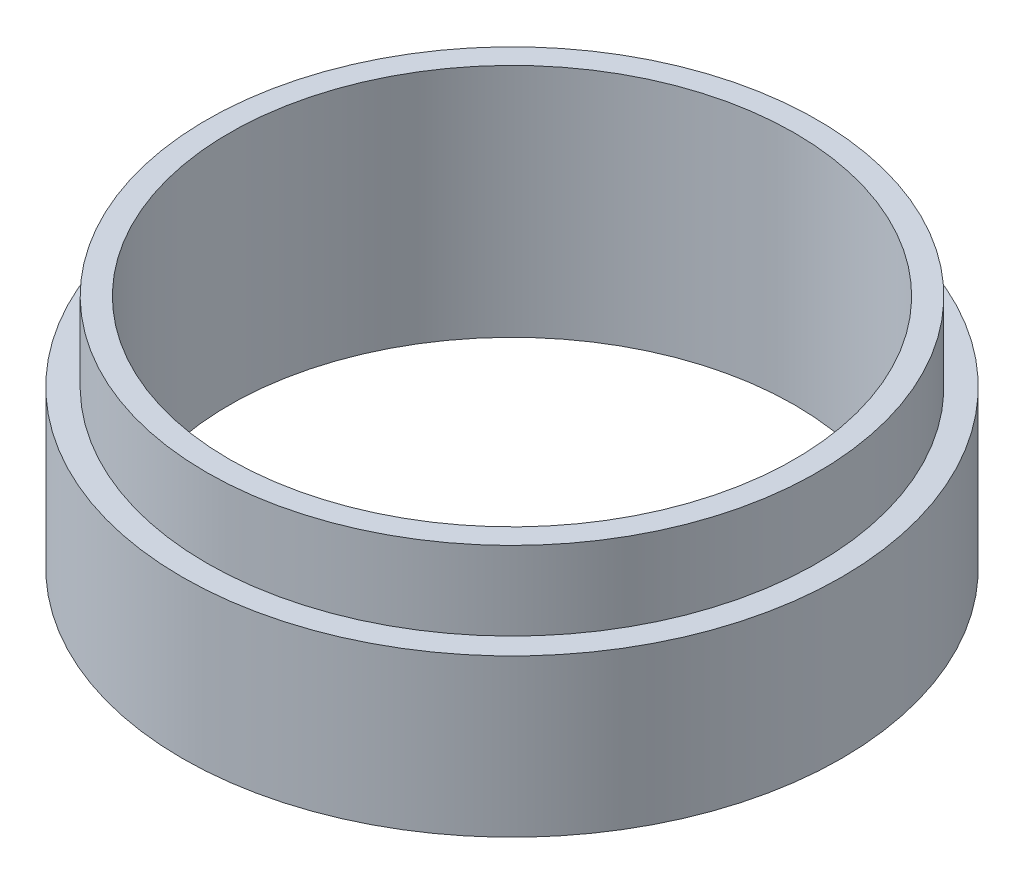
ISO-10303-21;
HEADER;
FILE_DESCRIPTION(('STEP AP214'),'2;1');
FILE_NAME('part.step','',(''),(''),'','','');
FILE_SCHEMA(('AUTOMOTIVE_DESIGN { 1 0 10303 214 1 1 1 1 }'));
ENDSEC;
DATA;
#1=APPLICATION_CONTEXT('core data for automotive mechanical design processes');
#2=APPLICATION_PROTOCOL_DEFINITION('international standard','automotive_design',2000,#1);
#3=PRODUCT_CONTEXT('',#1,'mechanical');
#4=PRODUCT('Part','Part','',(#3));
#5=PRODUCT_RELATED_PRODUCT_CATEGORY('part','',(#4));
#6=PRODUCT_DEFINITION_FORMATION('','',#4);
#7=PRODUCT_DEFINITION_CONTEXT('part definition',#1,'design');
#8=PRODUCT_DEFINITION('design','',#6,#7);
#9=PRODUCT_DEFINITION_SHAPE('','',#8);
#10=(LENGTH_UNIT() NAMED_UNIT(*) SI_UNIT(.MILLI.,.METRE.));
#11=(NAMED_UNIT(*) PLANE_ANGLE_UNIT() SI_UNIT($,.RADIAN.));
#12=(NAMED_UNIT(*) SI_UNIT($,.STERADIAN.) SOLID_ANGLE_UNIT());
#13=UNCERTAINTY_MEASURE_WITH_UNIT(LENGTH_MEASURE(1.E-05),#10,'distance_accuracy_value','');
#14=(GEOMETRIC_REPRESENTATION_CONTEXT(3) GLOBAL_UNCERTAINTY_ASSIGNED_CONTEXT((#13)) GLOBAL_UNIT_ASSIGNED_CONTEXT((#10,
#11,#12)) REPRESENTATION_CONTEXT('',''));
#15=CARTESIAN_POINT('',(0.,0.,0.));
#16=DIRECTION('',(0.,0.,1.));
#17=DIRECTION('',(1.,0.,0.));
#18=AXIS2_PLACEMENT_3D('',#15,#16,#17);
#19=CARTESIAN_POINT('',(0.,0.,0.));
#20=DIRECTION('',(0.,-1.,0.));
#21=DIRECTION('',(0.,0.,-1.));
#22=AXIS2_PLACEMENT_3D('',#19,#20,#21);
#23=CYLINDRICAL_SURFACE('',#22,21.);
#24=CARTESIAN_POINT('',(0.,10.,0.));
#25=DIRECTION('',(0.,-1.,0.));
#26=DIRECTION('',(0.,0.,-1.));
#27=AXIS2_PLACEMENT_3D('',#24,#25,#26);
#28=CIRCLE('',#27,21.);
#29=CARTESIAN_POINT('',(0.,10.,-21.));
#30=VERTEX_POINT('',#29);
#31=EDGE_CURVE('E37',#30,#30,#28,.T.);
#32=ORIENTED_EDGE('',*,*,#31,.T.);
#33=EDGE_LOOP('',(#32));
#34=FACE_BOUND('',#33,.T.);
#35=CARTESIAN_POINT('',(0.,0.,0.));
#36=DIRECTION('',(0.,-1.,0.));
#37=DIRECTION('',(0.,0.,-1.));
#38=AXIS2_PLACEMENT_3D('',#35,#36,#37);
#39=CIRCLE('',#38,21.);
#40=CARTESIAN_POINT('',(0.,0.,-21.));
#41=VERTEX_POINT('',#40);
#42=EDGE_CURVE('E48',#41,#41,#39,.T.);
#43=ORIENTED_EDGE('',*,*,#42,.F.);
#44=EDGE_LOOP('',(#43));
#45=FACE_BOUND('',#44,.T.);
#46=ADVANCED_FACE('F40',(#34,#45),#23,.T.);
#47=CARTESIAN_POINT('',(0.,10.,0.));
#48=DIRECTION('',(0.,1.,0.));
#49=DIRECTION('',(0.,0.,1.));
#50=AXIS2_PLACEMENT_3D('',#47,#48,#49);
#51=PLANE('',#50);
#52=CARTESIAN_POINT('',(0.,10.,0.));
#53=DIRECTION('',(0.,1.,0.));
#54=DIRECTION('',(0.,0.,1.));
#55=AXIS2_PLACEMENT_3D('',#52,#53,#54);
#56=CIRCLE('',#55,19.45);
#57=CARTESIAN_POINT('',(0.,10.,19.45));
#58=VERTEX_POINT('',#57);
#59=EDGE_CURVE('E10',#58,#58,#56,.T.);
#60=ORIENTED_EDGE('',*,*,#59,.F.);
#61=EDGE_LOOP('',(#60));
#62=FACE_BOUND('',#61,.T.);
#63=ORIENTED_EDGE('',*,*,#31,.F.);
#64=EDGE_LOOP('',(#63));
#65=FACE_BOUND('',#64,.T.);
#66=ADVANCED_FACE('F63',(#62,#65),#51,.T.);
#67=CARTESIAN_POINT('',(0.,0.,0.));
#68=DIRECTION('',(0.,-1.,0.));
#69=DIRECTION('',(0.,0.,-1.));
#70=AXIS2_PLACEMENT_3D('',#67,#68,#69);
#71=PLANE('',#70);
#72=CARTESIAN_POINT('',(0.,0.,0.));
#73=DIRECTION('',(0.,1.,0.));
#74=DIRECTION('',(0.,0.,1.));
#75=AXIS2_PLACEMENT_3D('',#72,#73,#74);
#76=CIRCLE('',#75,18.);
#77=CARTESIAN_POINT('',(0.,0.,18.));
#78=VERTEX_POINT('',#77);
#79=EDGE_CURVE('E52',#78,#78,#76,.T.);
#80=ORIENTED_EDGE('',*,*,#79,.T.);
#81=EDGE_LOOP('',(#80));
#82=FACE_BOUND('',#81,.T.);
#83=ORIENTED_EDGE('',*,*,#42,.T.);
#84=EDGE_LOOP('',(#83));
#85=FACE_BOUND('',#84,.T.);
#86=ADVANCED_FACE('F59',(#82,#85),#71,.T.);
#87=CARTESIAN_POINT('',(0.,0.,0.));
#88=DIRECTION('',(0.,1.,0.));
#89=DIRECTION('',(0.,0.,1.));
#90=AXIS2_PLACEMENT_3D('',#87,#88,#89);
#91=CYLINDRICAL_SURFACE('',#90,18.);
#92=ORIENTED_EDGE('',*,*,#79,.F.);
#93=EDGE_LOOP('',(#92));
#94=FACE_BOUND('',#93,.T.);
#95=CARTESIAN_POINT('',(0.,15.,0.));
#96=DIRECTION('',(0.,1.,0.));
#97=DIRECTION('',(0.,0.,1.));
#98=AXIS2_PLACEMENT_3D('',#95,#96,#97);
#99=CIRCLE('',#98,18.);
#100=CARTESIAN_POINT('',(0.,15.,18.));
#101=VERTEX_POINT('',#100);
#102=EDGE_CURVE('E93',#101,#101,#99,.T.);
#103=ORIENTED_EDGE('',*,*,#102,.T.);
#104=EDGE_LOOP('',(#103));
#105=FACE_BOUND('',#104,.T.);
#106=ADVANCED_FACE('F71',(#94,#105),#91,.F.);
#107=CARTESIAN_POINT('',(0.,15.,0.));
#108=DIRECTION('',(0.,1.,0.));
#109=DIRECTION('',(0.,0.,1.));
#110=AXIS2_PLACEMENT_3D('',#107,#108,#109);
#111=PLANE('',#110);
#112=ORIENTED_EDGE('',*,*,#102,.F.);
#113=EDGE_LOOP('',(#112));
#114=FACE_BOUND('',#113,.T.);
#115=CARTESIAN_POINT('',(0.,15.,0.));
#116=DIRECTION('',(0.,1.,0.));
#117=DIRECTION('',(0.,0.,1.));
#118=AXIS2_PLACEMENT_3D('',#115,#116,#117);
#119=CIRCLE('',#118,19.45);
#120=CARTESIAN_POINT('',(0.,15.,19.45));
#121=VERTEX_POINT('',#120);
#122=EDGE_CURVE('E51',#121,#121,#119,.T.);
#123=ORIENTED_EDGE('',*,*,#122,.T.);
#124=EDGE_LOOP('',(#123));
#125=FACE_BOUND('',#124,.T.);
#126=ADVANCED_FACE('F80',(#114,#125),#111,.T.);
#127=CARTESIAN_POINT('',(0.,15.,0.));
#128=DIRECTION('',(0.,-1.,0.));
#129=DIRECTION('',(0.,0.,-1.));
#130=AXIS2_PLACEMENT_3D('',#127,#128,#129);
#131=CYLINDRICAL_SURFACE('',#130,19.45);
#132=ORIENTED_EDGE('',*,*,#122,.F.);
#133=EDGE_LOOP('',(#132));
#134=FACE_BOUND('',#133,.T.);
#135=ORIENTED_EDGE('',*,*,#59,.T.);
#136=EDGE_LOOP('',(#135));
#137=FACE_BOUND('',#136,.T.);
#138=ADVANCED_FACE('F81',(#134,#137),#131,.T.);
#139=CLOSED_SHELL('',(#46,#66,#86,#106,#126,#138));
#140=MANIFOLD_SOLID_BREP('B2',#139);
#141=ADVANCED_BREP_SHAPE_REPRESENTATION('',(#18,#140),#14);
#142=SHAPE_DEFINITION_REPRESENTATION(#9,#141);
ENDSEC;
END-ISO-10303-21;
